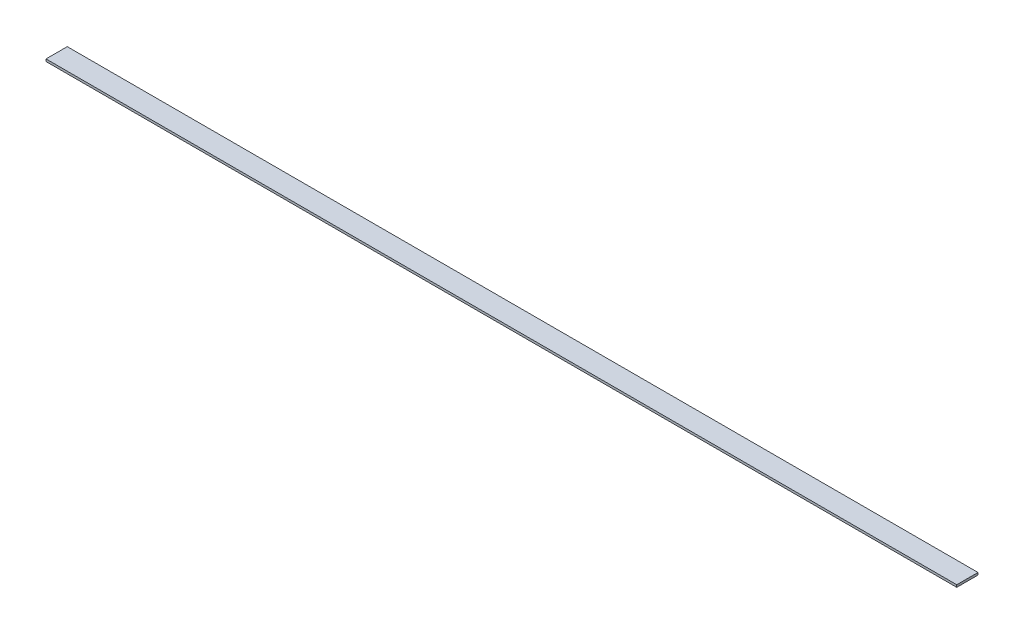
ISO-10303-21;
HEADER;
FILE_DESCRIPTION(('STEP AP214'),'2;1');
FILE_NAME('part.step','',(''),(''),'','','');
FILE_SCHEMA(('AUTOMOTIVE_DESIGN { 1 0 10303 214 1 1 1 1 }'));
ENDSEC;
DATA;
#1=APPLICATION_CONTEXT('core data for automotive mechanical design processes');
#2=APPLICATION_PROTOCOL_DEFINITION('international standard','automotive_design',2000,#1);
#3=PRODUCT_CONTEXT('',#1,'mechanical');
#4=PRODUCT('Part','Part','',(#3));
#5=PRODUCT_RELATED_PRODUCT_CATEGORY('part','',(#4));
#6=PRODUCT_DEFINITION_FORMATION('','',#4);
#7=PRODUCT_DEFINITION_CONTEXT('part definition',#1,'design');
#8=PRODUCT_DEFINITION('design','',#6,#7);
#9=PRODUCT_DEFINITION_SHAPE('','',#8);
#10=(LENGTH_UNIT() NAMED_UNIT(*) SI_UNIT(.MILLI.,.METRE.));
#11=(NAMED_UNIT(*) PLANE_ANGLE_UNIT() SI_UNIT($,.RADIAN.));
#12=(NAMED_UNIT(*) SI_UNIT($,.STERADIAN.) SOLID_ANGLE_UNIT());
#13=UNCERTAINTY_MEASURE_WITH_UNIT(LENGTH_MEASURE(1.E-05),#10,'distance_accuracy_value','');
#14=(GEOMETRIC_REPRESENTATION_CONTEXT(3) GLOBAL_UNCERTAINTY_ASSIGNED_CONTEXT((#13)) GLOBAL_UNIT_ASSIGNED_CONTEXT((#10,
#11,#12)) REPRESENTATION_CONTEXT('',''));
#15=CARTESIAN_POINT('',(0.,0.,0.));
#16=DIRECTION('',(0.,0.,1.));
#17=DIRECTION('',(1.,0.,0.));
#18=AXIS2_PLACEMENT_3D('',#15,#16,#17);
#19=CARTESIAN_POINT('',(0.,0.75,0.));
#20=DIRECTION('',(1.,0.,0.));
#21=DIRECTION('',(0.,0.,-1.));
#22=AXIS2_PLACEMENT_3D('',#19,#20,#21);
#23=PLANE('',#22);
#24=DIRECTION('',(0.,0.,1.));
#25=VECTOR('',#24,1.);
#26=CARTESIAN_POINT('',(0.,0.,0.));
#27=LINE('',#26,#25);
#28=CARTESIAN_POINT('',(0.,0.,-7.));
#29=VERTEX_POINT('',#28);
#30=CARTESIAN_POINT('',(0.,0.,0.));
#31=VERTEX_POINT('',#30);
#32=EDGE_CURVE('E98',#29,#31,#27,.T.);
#33=ORIENTED_EDGE('',*,*,#32,.T.);
#34=DIRECTION('',(0.,-1.,0.));
#35=VECTOR('',#34,1.);
#36=CARTESIAN_POINT('',(0.,0.75,0.));
#37=LINE('',#36,#35);
#38=CARTESIAN_POINT('',(0.,0.75,0.));
#39=VERTEX_POINT('',#38);
#40=EDGE_CURVE('E11',#39,#31,#37,.T.);
#41=ORIENTED_EDGE('',*,*,#40,.F.);
#42=DIRECTION('',(0.,0.,1.));
#43=VECTOR('',#42,1.);
#44=CARTESIAN_POINT('',(0.,0.75,0.));
#45=LINE('',#44,#43);
#46=CARTESIAN_POINT('',(0.,0.75,-7.));
#47=VERTEX_POINT('',#46);
#48=EDGE_CURVE('E86',#47,#39,#45,.T.);
#49=ORIENTED_EDGE('',*,*,#48,.F.);
#50=DIRECTION('',(0.,-1.,0.));
#51=VECTOR('',#50,1.);
#52=CARTESIAN_POINT('',(0.,0.75,-7.));
#53=LINE('',#52,#51);
#54=EDGE_CURVE('E94',#47,#29,#53,.T.);
#55=ORIENTED_EDGE('',*,*,#54,.T.);
#56=EDGE_LOOP('',(#33,#41,#49,#55));
#57=FACE_BOUND('',#56,.T.);
#58=ADVANCED_FACE('F35',(#57),#23,.F.);
#59=CARTESIAN_POINT('',(0.,0.75,0.));
#60=DIRECTION('',(0.,0.,-1.));
#61=DIRECTION('',(-1.,0.,0.));
#62=AXIS2_PLACEMENT_3D('',#59,#60,#61);
#63=PLANE('',#62);
#64=DIRECTION('',(1.,0.,0.));
#65=VECTOR('',#64,1.);
#66=CARTESIAN_POINT('',(0.,0.,0.));
#67=LINE('',#66,#65);
#68=CARTESIAN_POINT('',(300.,0.,0.));
#69=VERTEX_POINT('',#68);
#70=EDGE_CURVE('E90',#31,#69,#67,.T.);
#71=ORIENTED_EDGE('',*,*,#70,.T.);
#72=DIRECTION('',(0.,-1.,0.));
#73=VECTOR('',#72,1.);
#74=CARTESIAN_POINT('',(300.,0.75,0.));
#75=LINE('',#74,#73);
#76=CARTESIAN_POINT('',(300.,0.75,0.));
#77=VERTEX_POINT('',#76);
#78=EDGE_CURVE('E43',#77,#69,#75,.T.);
#79=ORIENTED_EDGE('',*,*,#78,.F.);
#80=DIRECTION('',(1.,0.,0.));
#81=VECTOR('',#80,1.);
#82=CARTESIAN_POINT('',(0.,0.75,0.));
#83=LINE('',#82,#81);
#84=EDGE_CURVE('E81',#39,#77,#83,.T.);
#85=ORIENTED_EDGE('',*,*,#84,.F.);
#86=ORIENTED_EDGE('',*,*,#40,.T.);
#87=EDGE_LOOP('',(#71,#79,#85,#86));
#88=FACE_BOUND('',#87,.T.);
#89=ADVANCED_FACE('F89',(#88),#63,.F.);
#90=CARTESIAN_POINT('',(300.,0.75,0.));
#91=DIRECTION('',(-1.,0.,0.));
#92=DIRECTION('',(0.,0.,1.));
#93=AXIS2_PLACEMENT_3D('',#90,#91,#92);
#94=PLANE('',#93);
#95=DIRECTION('',(0.,0.,-1.));
#96=VECTOR('',#95,1.);
#97=CARTESIAN_POINT('',(300.,0.,0.));
#98=LINE('',#97,#96);
#99=CARTESIAN_POINT('',(300.,0.,-7.));
#100=VERTEX_POINT('',#99);
#101=EDGE_CURVE('E68',#69,#100,#98,.T.);
#102=ORIENTED_EDGE('',*,*,#101,.T.);
#103=DIRECTION('',(0.,-1.,0.));
#104=VECTOR('',#103,1.);
#105=CARTESIAN_POINT('',(300.,0.75,-7.));
#106=LINE('',#105,#104);
#107=CARTESIAN_POINT('',(300.,0.75,-7.));
#108=VERTEX_POINT('',#107);
#109=EDGE_CURVE('E91',#108,#100,#106,.T.);
#110=ORIENTED_EDGE('',*,*,#109,.F.);
#111=DIRECTION('',(0.,0.,-1.));
#112=VECTOR('',#111,1.);
#113=CARTESIAN_POINT('',(300.,0.75,0.));
#114=LINE('',#113,#112);
#115=EDGE_CURVE('E84',#77,#108,#114,.T.);
#116=ORIENTED_EDGE('',*,*,#115,.F.);
#117=ORIENTED_EDGE('',*,*,#78,.T.);
#118=EDGE_LOOP('',(#102,#110,#116,#117));
#119=FACE_BOUND('',#118,.T.);
#120=ADVANCED_FACE('F92',(#119),#94,.F.);
#121=CARTESIAN_POINT('',(0.,0.75,-7.));
#122=DIRECTION('',(0.,0.,1.));
#123=DIRECTION('',(1.,0.,0.));
#124=AXIS2_PLACEMENT_3D('',#121,#122,#123);
#125=PLANE('',#124);
#126=DIRECTION('',(-1.,0.,0.));
#127=VECTOR('',#126,1.);
#128=CARTESIAN_POINT('',(0.,0.,-7.));
#129=LINE('',#128,#127);
#130=EDGE_CURVE('E74',#100,#29,#129,.T.);
#131=ORIENTED_EDGE('',*,*,#130,.T.);
#132=ORIENTED_EDGE('',*,*,#54,.F.);
#133=DIRECTION('',(-1.,0.,0.));
#134=VECTOR('',#133,1.);
#135=CARTESIAN_POINT('',(0.,0.75,-7.));
#136=LINE('',#135,#134);
#137=EDGE_CURVE('E51',#108,#47,#136,.T.);
#138=ORIENTED_EDGE('',*,*,#137,.F.);
#139=ORIENTED_EDGE('',*,*,#109,.T.);
#140=EDGE_LOOP('',(#131,#132,#138,#139));
#141=FACE_BOUND('',#140,.T.);
#142=ADVANCED_FACE('F105',(#141),#125,.F.);
#143=CARTESIAN_POINT('',(0.,0.75,0.));
#144=DIRECTION('',(0.,-1.,0.));
#145=DIRECTION('',(0.,0.,-1.));
#146=AXIS2_PLACEMENT_3D('',#143,#144,#145);
#147=PLANE('',#146);
#148=ORIENTED_EDGE('',*,*,#48,.T.);
#149=ORIENTED_EDGE('',*,*,#84,.T.);
#150=ORIENTED_EDGE('',*,*,#115,.T.);
#151=ORIENTED_EDGE('',*,*,#137,.T.);
#152=EDGE_LOOP('',(#148,#149,#150,#151));
#153=FACE_BOUND('',#152,.T.);
#154=ADVANCED_FACE('F82',(#153),#147,.F.);
#155=CARTESIAN_POINT('',(0.,0.,0.));
#156=DIRECTION('',(0.,-1.,0.));
#157=DIRECTION('',(0.,0.,-1.));
#158=AXIS2_PLACEMENT_3D('',#155,#156,#157);
#159=PLANE('',#158);
#160=ORIENTED_EDGE('',*,*,#32,.F.);
#161=ORIENTED_EDGE('',*,*,#130,.F.);
#162=ORIENTED_EDGE('',*,*,#101,.F.);
#163=ORIENTED_EDGE('',*,*,#70,.F.);
#164=EDGE_LOOP('',(#160,#161,#162,#163));
#165=FACE_BOUND('',#164,.T.);
#166=ADVANCED_FACE('F108',(#165),#159,.T.);
#167=CLOSED_SHELL('',(#58,#89,#120,#142,#154,#166));
#168=MANIFOLD_SOLID_BREP('B2',#167);
#169=ADVANCED_BREP_SHAPE_REPRESENTATION('',(#18,#168),#14);
#170=SHAPE_DEFINITION_REPRESENTATION(#9,#169);
ENDSEC;
END-ISO-10303-21;
